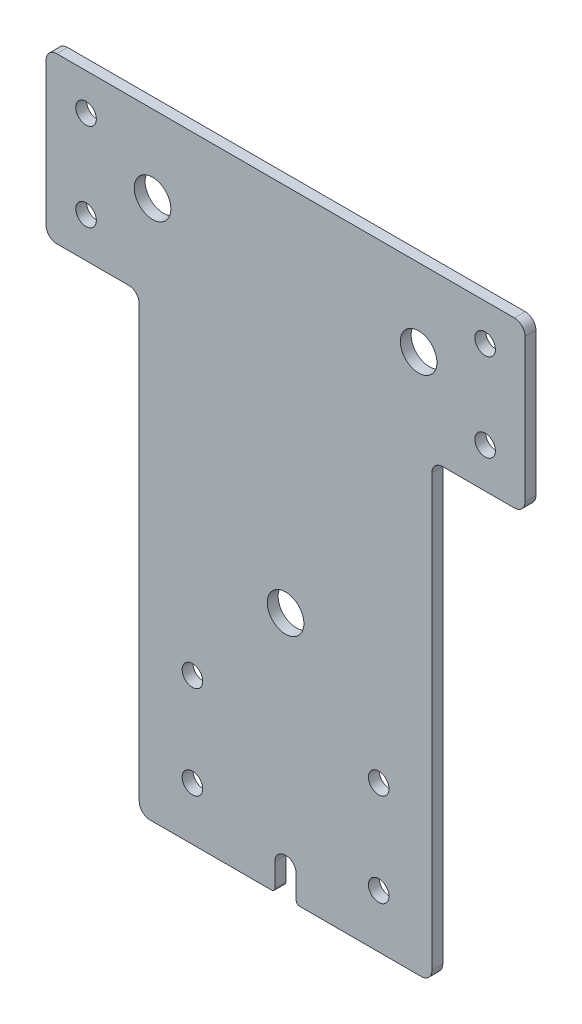
ISO-10303-21;
HEADER;
FILE_DESCRIPTION(('STEP AP214'),'2;1');
FILE_NAME('part.step','',(''),(''),'','','');
FILE_SCHEMA(('AUTOMOTIVE_DESIGN { 1 0 10303 214 1 1 1 1 }'));
ENDSEC;
DATA;
#1=APPLICATION_CONTEXT('core data for automotive mechanical design processes');
#2=APPLICATION_PROTOCOL_DEFINITION('international standard','automotive_design',2000,#1);
#3=PRODUCT_CONTEXT('',#1,'mechanical');
#4=PRODUCT('Part','Part','',(#3));
#5=PRODUCT_RELATED_PRODUCT_CATEGORY('part','',(#4));
#6=PRODUCT_DEFINITION_FORMATION('','',#4);
#7=PRODUCT_DEFINITION_CONTEXT('part definition',#1,'design');
#8=PRODUCT_DEFINITION('design','',#6,#7);
#9=PRODUCT_DEFINITION_SHAPE('','',#8);
#10=(LENGTH_UNIT() NAMED_UNIT(*) SI_UNIT(.MILLI.,.METRE.));
#11=(NAMED_UNIT(*) PLANE_ANGLE_UNIT() SI_UNIT($,.RADIAN.));
#12=(NAMED_UNIT(*) SI_UNIT($,.STERADIAN.) SOLID_ANGLE_UNIT());
#13=UNCERTAINTY_MEASURE_WITH_UNIT(LENGTH_MEASURE(1.E-05),#10,'distance_accuracy_value','');
#14=(GEOMETRIC_REPRESENTATION_CONTEXT(3) GLOBAL_UNCERTAINTY_ASSIGNED_CONTEXT((#13)) GLOBAL_UNIT_ASSIGNED_CONTEXT((#10,
#11,#12)) REPRESENTATION_CONTEXT('',''));
#15=CARTESIAN_POINT('',(0.,0.,0.));
#16=DIRECTION('',(0.,0.,1.));
#17=DIRECTION('',(1.,0.,0.));
#18=AXIS2_PLACEMENT_3D('',#15,#16,#17);
#19=CARTESIAN_POINT('',(69.85,-152.4,0.));
#20=DIRECTION('',(0.,-1.,0.));
#21=DIRECTION('',(0.,0.,-1.));
#22=AXIS2_PLACEMENT_3D('',#19,#20,#21);
#23=PLANE('',#22);
#24=DIRECTION('',(-1.,0.,0.));
#25=VECTOR('',#24,1.);
#26=CARTESIAN_POINT('',(69.85,-152.4,2.58825999999998));
#27=LINE('',#26,#25);
#28=CARTESIAN_POINT('',(67.31,-152.4,2.58825999999998));
#29=VERTEX_POINT('',#28);
#30=CARTESIAN_POINT('',(38.227,-152.4,2.58825999999998));
#31=VERTEX_POINT('',#30);
#32=EDGE_CURVE('E385',#29,#31,#27,.T.);
#33=ORIENTED_EDGE('',*,*,#32,.T.);
#34=DIRECTION('',(0.,0.,-1.));
#35=VECTOR('',#34,1.);
#36=CARTESIAN_POINT('',(38.227,-152.4,0.));
#37=LINE('',#36,#35);
#38=CARTESIAN_POINT('',(38.227,-152.4,0.));
#39=VERTEX_POINT('',#38);
#40=EDGE_CURVE('E51',#31,#39,#37,.T.);
#41=ORIENTED_EDGE('',*,*,#40,.T.);
#42=DIRECTION('',(-1.,0.,0.));
#43=VECTOR('',#42,1.);
#44=CARTESIAN_POINT('',(69.85,-152.4,0.));
#45=LINE('',#44,#43);
#46=CARTESIAN_POINT('',(67.31,-152.4,0.));
#47=VERTEX_POINT('',#46);
#48=EDGE_CURVE('E380',#47,#39,#45,.T.);
#49=ORIENTED_EDGE('',*,*,#48,.F.);
#50=DIRECTION('',(0.,0.,1.));
#51=VECTOR('',#50,1.);
#52=CARTESIAN_POINT('',(67.31,-152.4,2.58825999999998));
#53=LINE('',#52,#51);
#54=EDGE_CURVE('E461',#47,#29,#53,.T.);
#55=ORIENTED_EDGE('',*,*,#54,.T.);
#56=EDGE_LOOP('',(#33,#41,#49,#55));
#57=FACE_BOUND('',#56,.T.);
#58=ADVANCED_FACE('F42',(#57),#23,.T.);
#59=CARTESIAN_POINT('',(69.85,0.,0.));
#60=DIRECTION('',(0.,0.,1.));
#61=DIRECTION('',(0.,-1.,0.));
#62=AXIS2_PLACEMENT_3D('',#59,#60,#61);
#63=PLANE('',#62);
#64=CARTESIAN_POINT('',(66.675,-23.622,0.));
#65=DIRECTION('',(0.,0.,-1.));
#66=DIRECTION('',(0.,1.,0.));
#67=AXIS2_PLACEMENT_3D('',#64,#65,#66);
#68=CIRCLE('',#67,4.36879999999999);
#69=CARTESIAN_POINT('',(66.675,-19.2532,0.));
#70=VERTEX_POINT('',#69);
#71=EDGE_CURVE('E234',#70,#70,#68,.T.);
#72=ORIENTED_EDGE('',*,*,#71,.F.);
#73=EDGE_LOOP('',(#72));
#74=FACE_BOUND('',#73,.T.);
#75=CARTESIAN_POINT('',(3.175,-23.622,0.));
#76=DIRECTION('',(0.,0.,-1.));
#77=DIRECTION('',(0.,1.,0.));
#78=AXIS2_PLACEMENT_3D('',#75,#76,#77);
#79=CIRCLE('',#78,4.3688);
#80=CARTESIAN_POINT('',(3.175,-19.2532,0.));
#81=VERTEX_POINT('',#80);
#82=EDGE_CURVE('E243',#81,#81,#79,.T.);
#83=ORIENTED_EDGE('',*,*,#82,.F.);
#84=EDGE_LOOP('',(#83));
#85=FACE_BOUND('',#84,.T.);
#86=CARTESIAN_POINT('',(34.925,-93.472,0.));
#87=DIRECTION('',(0.,0.,-1.));
#88=DIRECTION('',(0.,1.,0.));
#89=AXIS2_PLACEMENT_3D('',#86,#87,#88);
#90=CIRCLE('',#89,4.3688);
#91=CARTESIAN_POINT('',(34.925,-89.1032,0.));
#92=VERTEX_POINT('',#91);
#93=EDGE_CURVE('E251',#92,#92,#90,.T.);
#94=ORIENTED_EDGE('',*,*,#93,.F.);
#95=EDGE_LOOP('',(#94));
#96=FACE_BOUND('',#95,.T.);
#97=CARTESIAN_POINT('',(12.7,-117.475,0.));
#98=DIRECTION('',(0.,0.,-1.));
#99=DIRECTION('',(0.,1.,0.));
#100=AXIS2_PLACEMENT_3D('',#97,#98,#99);
#101=CIRCLE('',#100,2.45744999999999);
#102=CARTESIAN_POINT('',(12.7,-115.01755,0.));
#103=VERTEX_POINT('',#102);
#104=EDGE_CURVE('E323',#103,#103,#101,.T.);
#105=ORIENTED_EDGE('',*,*,#104,.F.);
#106=EDGE_LOOP('',(#105));
#107=FACE_BOUND('',#106,.T.);
#108=CARTESIAN_POINT('',(12.7,-139.7,0.));
#109=DIRECTION('',(0.,0.,-1.));
#110=DIRECTION('',(0.,1.,0.));
#111=AXIS2_PLACEMENT_3D('',#108,#109,#110);
#112=CIRCLE('',#111,2.45744999999999);
#113=CARTESIAN_POINT('',(12.7,-137.24255,0.));
#114=VERTEX_POINT('',#113);
#115=EDGE_CURVE('E315',#114,#114,#112,.T.);
#116=ORIENTED_EDGE('',*,*,#115,.F.);
#117=EDGE_LOOP('',(#116));
#118=FACE_BOUND('',#117,.T.);
#119=CARTESIAN_POINT('',(57.15,-139.7,0.));
#120=DIRECTION('',(0.,0.,-1.));
#121=DIRECTION('',(0.,1.,0.));
#122=AXIS2_PLACEMENT_3D('',#119,#120,#121);
#123=CIRCLE('',#122,2.45744999999999);
#124=CARTESIAN_POINT('',(57.15,-137.24255,0.));
#125=VERTEX_POINT('',#124);
#126=EDGE_CURVE('E307',#125,#125,#123,.T.);
#127=ORIENTED_EDGE('',*,*,#126,.F.);
#128=EDGE_LOOP('',(#127));
#129=FACE_BOUND('',#128,.T.);
#130=CARTESIAN_POINT('',(57.15,-117.475,0.));
#131=DIRECTION('',(0.,0.,-1.));
#132=DIRECTION('',(0.,1.,0.));
#133=AXIS2_PLACEMENT_3D('',#130,#131,#132);
#134=CIRCLE('',#133,2.45744999999999);
#135=CARTESIAN_POINT('',(57.15,-115.01755,0.));
#136=VERTEX_POINT('',#135);
#137=EDGE_CURVE('E299',#136,#136,#134,.T.);
#138=ORIENTED_EDGE('',*,*,#137,.F.);
#139=EDGE_LOOP('',(#138));
#140=FACE_BOUND('',#139,.T.);
#141=CARTESIAN_POINT('',(-12.7,-13.97,0.));
#142=DIRECTION('',(0.,0.,-1.));
#143=DIRECTION('',(0.,1.,0.));
#144=AXIS2_PLACEMENT_3D('',#141,#142,#143);
#145=CIRCLE('',#144,2.45744999999999);
#146=CARTESIAN_POINT('',(-12.7,-11.51255,0.));
#147=VERTEX_POINT('',#146);
#148=EDGE_CURVE('E291',#147,#147,#145,.T.);
#149=ORIENTED_EDGE('',*,*,#148,.F.);
#150=EDGE_LOOP('',(#149));
#151=FACE_BOUND('',#150,.T.);
#152=CARTESIAN_POINT('',(-12.7,-34.925,0.));
#153=DIRECTION('',(0.,0.,-1.));
#154=DIRECTION('',(0.,1.,0.));
#155=AXIS2_PLACEMENT_3D('',#152,#153,#154);
#156=CIRCLE('',#155,2.45744999999999);
#157=CARTESIAN_POINT('',(-12.7,-32.46755,0.));
#158=VERTEX_POINT('',#157);
#159=EDGE_CURVE('E283',#158,#158,#156,.T.);
#160=ORIENTED_EDGE('',*,*,#159,.F.);
#161=EDGE_LOOP('',(#160));
#162=FACE_BOUND('',#161,.T.);
#163=CARTESIAN_POINT('',(82.55,-34.925,0.));
#164=DIRECTION('',(0.,0.,-1.));
#165=DIRECTION('',(0.,1.,0.));
#166=AXIS2_PLACEMENT_3D('',#163,#164,#165);
#167=CIRCLE('',#166,2.45744999999999);
#168=CARTESIAN_POINT('',(82.55,-32.46755,0.));
#169=VERTEX_POINT('',#168);
#170=EDGE_CURVE('E275',#169,#169,#167,.T.);
#171=ORIENTED_EDGE('',*,*,#170,.F.);
#172=EDGE_LOOP('',(#171));
#173=FACE_BOUND('',#172,.T.);
#174=CARTESIAN_POINT('',(82.55,-13.97,0.));
#175=DIRECTION('',(0.,0.,-1.));
#176=DIRECTION('',(0.,1.,0.));
#177=AXIS2_PLACEMENT_3D('',#174,#175,#176);
#178=CIRCLE('',#177,2.45744999999999);
#179=CARTESIAN_POINT('',(82.55,-11.51255,0.));
#180=VERTEX_POINT('',#179);
#181=EDGE_CURVE('E264',#180,#180,#178,.T.);
#182=ORIENTED_EDGE('',*,*,#181,.F.);
#183=EDGE_LOOP('',(#182));
#184=FACE_BOUND('',#183,.T.);
#185=DIRECTION('',(0.,1.,0.));
#186=VECTOR('',#185,1.);
#187=CARTESIAN_POINT('',(32.385,-146.05,0.));
#188=LINE('',#187,#186);
#189=CARTESIAN_POINT('',(32.385,-151.638,0.));
#190=VERTEX_POINT('',#189);
#191=CARTESIAN_POINT('',(32.385,-146.05,0.));
#192=VERTEX_POINT('',#191);
#193=EDGE_CURVE('E211',#190,#192,#188,.T.);
#194=ORIENTED_EDGE('',*,*,#193,.F.);
#195=CARTESIAN_POINT('',(31.623,-151.638,0.));
#196=DIRECTION('',(0.,0.,1.));
#197=DIRECTION('',(0.,-1.,0.));
#198=AXIS2_PLACEMENT_3D('',#195,#196,#197);
#199=CIRCLE('',#198,0.762);
#200=CARTESIAN_POINT('',(31.623,-152.4,0.));
#201=VERTEX_POINT('',#200);
#202=EDGE_CURVE('E500',#190,#201,#199,.F.);
#203=ORIENTED_EDGE('',*,*,#202,.T.);
#204=CARTESIAN_POINT('',(2.54,-152.4,0.));
#205=VERTEX_POINT('',#204);
#206=EDGE_CURVE('E373',#201,#205,#45,.T.);
#207=ORIENTED_EDGE('',*,*,#206,.T.);
#208=CARTESIAN_POINT('',(2.54,-149.86,0.));
#209=DIRECTION('',(0.,0.,1.));
#210=DIRECTION('',(0.,-1.,0.));
#211=AXIS2_PLACEMENT_3D('',#208,#209,#210);
#212=CIRCLE('',#211,2.54);
#213=CARTESIAN_POINT('',(0.,-149.86,0.));
#214=VERTEX_POINT('',#213);
#215=EDGE_CURVE('E426',#205,#214,#212,.F.);
#216=ORIENTED_EDGE('',*,*,#215,.T.);
#217=DIRECTION('',(0.,1.,0.));
#218=VECTOR('',#217,1.);
#219=CARTESIAN_POINT('',(0.,0.,0.));
#220=LINE('',#219,#218);
#221=CARTESIAN_POINT('',(0.,-46.99,0.));
#222=VERTEX_POINT('',#221);
#223=EDGE_CURVE('E360',#214,#222,#220,.T.);
#224=ORIENTED_EDGE('',*,*,#223,.T.);
#225=CARTESIAN_POINT('',(-2.54,-46.99,0.));
#226=DIRECTION('',(0.,0.,1.));
#227=DIRECTION('',(0.,-1.,0.));
#228=AXIS2_PLACEMENT_3D('',#225,#226,#227);
#229=CIRCLE('',#228,2.54);
#230=CARTESIAN_POINT('',(-2.54,-44.45,0.));
#231=VERTEX_POINT('',#230);
#232=EDGE_CURVE('E482',#222,#231,#229,.T.);
#233=ORIENTED_EDGE('',*,*,#232,.T.);
#234=DIRECTION('',(-1.,0.,0.));
#235=VECTOR('',#234,1.);
#236=CARTESIAN_POINT('',(0.,-44.45,0.));
#237=LINE('',#236,#235);
#238=CARTESIAN_POINT('',(-19.685,-44.45,0.));
#239=VERTEX_POINT('',#238);
#240=EDGE_CURVE('E331',#231,#239,#237,.T.);
#241=ORIENTED_EDGE('',*,*,#240,.T.);
#242=CARTESIAN_POINT('',(-19.685,-41.91,0.));
#243=DIRECTION('',(0.,0.,1.));
#244=DIRECTION('',(0.,-1.,0.));
#245=AXIS2_PLACEMENT_3D('',#242,#243,#244);
#246=CIRCLE('',#245,2.54);
#247=CARTESIAN_POINT('',(-22.225,-41.91,0.));
#248=VERTEX_POINT('',#247);
#249=EDGE_CURVE('E429',#239,#248,#246,.F.);
#250=ORIENTED_EDGE('',*,*,#249,.T.);
#251=DIRECTION('',(0.,1.,0.));
#252=VECTOR('',#251,1.);
#253=CARTESIAN_POINT('',(-22.225,0.,0.));
#254=LINE('',#253,#252);
#255=CARTESIAN_POINT('',(-22.225,-7.70255,0.));
#256=VERTEX_POINT('',#255);
#257=EDGE_CURVE('E332',#248,#256,#254,.T.);
#258=ORIENTED_EDGE('',*,*,#257,.T.);
#259=CARTESIAN_POINT('',(-19.685,-7.70255,0.));
#260=DIRECTION('',(0.,0.,1.));
#261=DIRECTION('',(0.,-1.,0.));
#262=AXIS2_PLACEMENT_3D('',#259,#260,#261);
#263=CIRCLE('',#262,2.54);
#264=CARTESIAN_POINT('',(-19.685,-5.16255,0.));
#265=VERTEX_POINT('',#264);
#266=EDGE_CURVE('E435',#256,#265,#263,.F.);
#267=ORIENTED_EDGE('',*,*,#266,.T.);
#268=DIRECTION('',(-1.,0.,0.));
#269=VECTOR('',#268,1.);
#270=CARTESIAN_POINT('',(92.075,-5.16255,0.));
#271=LINE('',#270,#269);
#272=CARTESIAN_POINT('',(89.535,-5.16255,0.));
#273=VERTEX_POINT('',#272);
#274=EDGE_CURVE('E259',#273,#265,#271,.T.);
#275=ORIENTED_EDGE('',*,*,#274,.F.);
#276=CARTESIAN_POINT('',(89.535,-7.70255,0.));
#277=DIRECTION('',(0.,0.,1.));
#278=DIRECTION('',(0.,-1.,0.));
#279=AXIS2_PLACEMENT_3D('',#276,#277,#278);
#280=CIRCLE('',#279,2.54);
#281=CARTESIAN_POINT('',(92.075,-7.70255,0.));
#282=VERTEX_POINT('',#281);
#283=EDGE_CURVE('E432',#273,#282,#280,.F.);
#284=ORIENTED_EDGE('',*,*,#283,.T.);
#285=DIRECTION('',(0.,-1.,0.));
#286=VECTOR('',#285,1.);
#287=CARTESIAN_POINT('',(92.075,0.,0.));
#288=LINE('',#287,#286);
#289=CARTESIAN_POINT('',(92.075,-41.91,0.));
#290=VERTEX_POINT('',#289);
#291=EDGE_CURVE('E344',#282,#290,#288,.T.);
#292=ORIENTED_EDGE('',*,*,#291,.T.);
#293=CARTESIAN_POINT('',(89.535,-41.91,0.));
#294=DIRECTION('',(0.,0.,1.));
#295=DIRECTION('',(0.,-1.,0.));
#296=AXIS2_PLACEMENT_3D('',#293,#294,#295);
#297=CIRCLE('',#296,2.54);
#298=CARTESIAN_POINT('',(89.535,-44.45,0.));
#299=VERTEX_POINT('',#298);
#300=EDGE_CURVE('E420',#290,#299,#297,.F.);
#301=ORIENTED_EDGE('',*,*,#300,.T.);
#302=DIRECTION('',(-1.,0.,0.));
#303=VECTOR('',#302,1.);
#304=CARTESIAN_POINT('',(69.85,-44.45,0.));
#305=LINE('',#304,#303);
#306=CARTESIAN_POINT('',(72.39,-44.45,0.));
#307=VERTEX_POINT('',#306);
#308=EDGE_CURVE('E348',#299,#307,#305,.T.);
#309=ORIENTED_EDGE('',*,*,#308,.T.);
#310=CARTESIAN_POINT('',(72.39,-46.99,0.));
#311=DIRECTION('',(0.,0.,1.));
#312=DIRECTION('',(0.,-1.,0.));
#313=AXIS2_PLACEMENT_3D('',#310,#311,#312);
#314=CIRCLE('',#313,2.54);
#315=CARTESIAN_POINT('',(69.85,-46.99,0.));
#316=VERTEX_POINT('',#315);
#317=EDGE_CURVE('E488',#307,#316,#314,.T.);
#318=ORIENTED_EDGE('',*,*,#317,.T.);
#319=DIRECTION('',(0.,1.,0.));
#320=VECTOR('',#319,1.);
#321=CARTESIAN_POINT('',(69.85,0.,0.));
#322=LINE('',#321,#320);
#323=CARTESIAN_POINT('',(69.85,-149.86,0.));
#324=VERTEX_POINT('',#323);
#325=EDGE_CURVE('E364',#324,#316,#322,.T.);
#326=ORIENTED_EDGE('',*,*,#325,.F.);
#327=CARTESIAN_POINT('',(67.31,-149.86,0.));
#328=DIRECTION('',(0.,0.,1.));
#329=DIRECTION('',(0.,-1.,0.));
#330=AXIS2_PLACEMENT_3D('',#327,#328,#329);
#331=CIRCLE('',#330,2.54);
#332=EDGE_CURVE('E423',#324,#47,#331,.F.);
#333=ORIENTED_EDGE('',*,*,#332,.T.);
#334=ORIENTED_EDGE('',*,*,#48,.T.);
#335=CARTESIAN_POINT('',(38.227,-151.638,0.));
#336=DIRECTION('',(0.,0.,1.));
#337=DIRECTION('',(0.,-1.,0.));
#338=AXIS2_PLACEMENT_3D('',#335,#336,#337);
#339=CIRCLE('',#338,0.762);
#340=CARTESIAN_POINT('',(37.465,-151.638,0.));
#341=VERTEX_POINT('',#340);
#342=EDGE_CURVE('E497',#39,#341,#339,.F.);
#343=ORIENTED_EDGE('',*,*,#342,.T.);
#344=DIRECTION('',(0.,-1.,0.));
#345=VECTOR('',#344,1.);
#346=CARTESIAN_POINT('',(37.465,-152.4,0.));
#347=LINE('',#346,#345);
#348=CARTESIAN_POINT('',(37.465,-146.05,0.));
#349=VERTEX_POINT('',#348);
#350=EDGE_CURVE('E205',#349,#341,#347,.T.);
#351=ORIENTED_EDGE('',*,*,#350,.F.);
#352=CARTESIAN_POINT('',(34.925,-146.05,0.));
#353=DIRECTION('',(0.,0.,-1.));
#354=DIRECTION('',(0.,-1.,0.));
#355=AXIS2_PLACEMENT_3D('',#352,#353,#354);
#356=CIRCLE('',#355,2.54);
#357=EDGE_CURVE('E228',#192,#349,#356,.T.);
#358=ORIENTED_EDGE('',*,*,#357,.F.);
#359=EDGE_LOOP('',(#194,#203,#207,#216,#224,#233,#241,#250,#258,#267,#275,#284,#292,#301,#309,
#318,#326,#333,#334,#343,#351,#358));
#360=FACE_BOUND('',#359,.T.);
#361=ADVANCED_FACE('F518',(#74,#85,#96,#107,#118,#129,#140,#151,#162,#173,#184,#360),#63,.F.);
#362=CARTESIAN_POINT('',(69.85,0.,2.58826));
#363=DIRECTION('',(0.,0.,1.));
#364=DIRECTION('',(0.,-1.,0.));
#365=AXIS2_PLACEMENT_3D('',#362,#363,#364);
#366=PLANE('',#365);
#367=CARTESIAN_POINT('',(31.623,-152.4,2.58825999999998));
#368=VERTEX_POINT('',#367);
#369=CARTESIAN_POINT('',(2.54,-152.4,2.58825999999998));
#370=VERTEX_POINT('',#369);
#371=EDGE_CURVE('E384',#368,#370,#27,.T.);
#372=ORIENTED_EDGE('',*,*,#371,.F.);
#373=CARTESIAN_POINT('',(31.623,-151.638,2.58825999999998));
#374=DIRECTION('',(0.,0.,1.));
#375=DIRECTION('',(0.,-1.,0.));
#376=AXIS2_PLACEMENT_3D('',#373,#374,#375);
#377=CIRCLE('',#376,0.762);
#378=CARTESIAN_POINT('',(32.385,-151.638,2.58826000000003));
#379=VERTEX_POINT('',#378);
#380=EDGE_CURVE('E200',#368,#379,#377,.T.);
#381=ORIENTED_EDGE('',*,*,#380,.T.);
#382=DIRECTION('',(0.,1.,0.));
#383=VECTOR('',#382,1.);
#384=CARTESIAN_POINT('',(32.385,-146.05,2.58826000000003));
#385=LINE('',#384,#383);
#386=CARTESIAN_POINT('',(32.385,-146.05,2.58826000000003));
#387=VERTEX_POINT('',#386);
#388=EDGE_CURVE('E192',#379,#387,#385,.T.);
#389=ORIENTED_EDGE('',*,*,#388,.T.);
#390=CARTESIAN_POINT('',(34.925,-146.05,2.58826000000003));
#391=DIRECTION('',(0.,0.,-1.));
#392=DIRECTION('',(0.,-1.,0.));
#393=AXIS2_PLACEMENT_3D('',#390,#391,#392);
#394=CIRCLE('',#393,2.54);
#395=CARTESIAN_POINT('',(37.465,-146.05,2.58826000000003));
#396=VERTEX_POINT('',#395);
#397=EDGE_CURVE('E198',#387,#396,#394,.T.);
#398=ORIENTED_EDGE('',*,*,#397,.T.);
#399=DIRECTION('',(0.,-1.,0.));
#400=VECTOR('',#399,1.);
#401=CARTESIAN_POINT('',(37.465,-152.4,2.58826000000003));
#402=LINE('',#401,#400);
#403=CARTESIAN_POINT('',(37.465,-151.638,2.58826000000003));
#404=VERTEX_POINT('',#403);
#405=EDGE_CURVE('E217',#396,#404,#402,.T.);
#406=ORIENTED_EDGE('',*,*,#405,.T.);
#407=CARTESIAN_POINT('',(38.227,-151.638,2.58825999999998));
#408=DIRECTION('',(0.,0.,1.));
#409=DIRECTION('',(0.,-1.,0.));
#410=AXIS2_PLACEMENT_3D('',#407,#408,#409);
#411=CIRCLE('',#410,0.762);
#412=EDGE_CURVE('E58',#404,#31,#411,.T.);
#413=ORIENTED_EDGE('',*,*,#412,.T.);
#414=ORIENTED_EDGE('',*,*,#32,.F.);
#415=CARTESIAN_POINT('',(67.31,-149.86,2.58825999999998));
#416=DIRECTION('',(0.,0.,1.));
#417=DIRECTION('',(0.,-1.,0.));
#418=AXIS2_PLACEMENT_3D('',#415,#416,#417);
#419=CIRCLE('',#418,2.54);
#420=CARTESIAN_POINT('',(69.85,-149.86,2.58825999999998));
#421=VERTEX_POINT('',#420);
#422=EDGE_CURVE('E398',#29,#421,#419,.T.);
#423=ORIENTED_EDGE('',*,*,#422,.T.);
#424=DIRECTION('',(0.,1.,0.));
#425=VECTOR('',#424,1.);
#426=CARTESIAN_POINT('',(69.85,0.,2.58826));
#427=LINE('',#426,#425);
#428=CARTESIAN_POINT('',(69.85,-46.99,2.58825999999999));
#429=VERTEX_POINT('',#428);
#430=EDGE_CURVE('E368',#421,#429,#427,.T.);
#431=ORIENTED_EDGE('',*,*,#430,.T.);
#432=CARTESIAN_POINT('',(72.39,-46.99,2.58826));
#433=DIRECTION('',(0.,0.,1.));
#434=DIRECTION('',(0.,-1.,0.));
#435=AXIS2_PLACEMENT_3D('',#432,#433,#434);
#436=CIRCLE('',#435,2.54);
#437=CARTESIAN_POINT('',(72.39,-44.45,2.58826));
#438=VERTEX_POINT('',#437);
#439=EDGE_CURVE('E491',#429,#438,#436,.F.);
#440=ORIENTED_EDGE('',*,*,#439,.T.);
#441=DIRECTION('',(-1.,0.,0.));
#442=VECTOR('',#441,1.);
#443=CARTESIAN_POINT('',(69.85,-44.45,2.58826));
#444=LINE('',#443,#442);
#445=CARTESIAN_POINT('',(89.535,-44.45,2.58826));
#446=VERTEX_POINT('',#445);
#447=EDGE_CURVE('E356',#446,#438,#444,.T.);
#448=ORIENTED_EDGE('',*,*,#447,.F.);
#449=CARTESIAN_POINT('',(89.535,-41.91,2.58826));
#450=DIRECTION('',(0.,0.,1.));
#451=DIRECTION('',(0.,-1.,0.));
#452=AXIS2_PLACEMENT_3D('',#449,#450,#451);
#453=CIRCLE('',#452,2.54);
#454=CARTESIAN_POINT('',(92.075,-41.91,2.58826));
#455=VERTEX_POINT('',#454);
#456=EDGE_CURVE('E395',#446,#455,#453,.T.);
#457=ORIENTED_EDGE('',*,*,#456,.T.);
#458=DIRECTION('',(0.,-1.,0.));
#459=VECTOR('',#458,1.);
#460=CARTESIAN_POINT('',(92.075,0.,2.58826));
#461=LINE('',#460,#459);
#462=CARTESIAN_POINT('',(92.075,-7.70255,2.58826));
#463=VERTEX_POINT('',#462);
#464=EDGE_CURVE('E352',#463,#455,#461,.T.);
#465=ORIENTED_EDGE('',*,*,#464,.F.);
#466=CARTESIAN_POINT('',(89.535,-7.70255,2.58826));
#467=DIRECTION('',(0.,0.,1.));
#468=DIRECTION('',(0.,-1.,0.));
#469=AXIS2_PLACEMENT_3D('',#466,#467,#468);
#470=CIRCLE('',#469,2.54);
#471=CARTESIAN_POINT('',(89.535,-5.16255,2.58826));
#472=VERTEX_POINT('',#471);
#473=EDGE_CURVE('E408',#463,#472,#470,.T.);
#474=ORIENTED_EDGE('',*,*,#473,.T.);
#475=DIRECTION('',(1.,0.,0.));
#476=VECTOR('',#475,1.);
#477=CARTESIAN_POINT('',(69.85,-5.16255,2.58826));
#478=LINE('',#477,#476);
#479=CARTESIAN_POINT('',(-19.685,-5.16255,2.58826));
#480=VERTEX_POINT('',#479);
#481=EDGE_CURVE('E260',#472,#480,#478,.F.);
#482=ORIENTED_EDGE('',*,*,#481,.T.);
#483=CARTESIAN_POINT('',(-19.685,-7.70255,2.58826));
#484=DIRECTION('',(0.,0.,1.));
#485=DIRECTION('',(0.,-1.,0.));
#486=AXIS2_PLACEMENT_3D('',#483,#484,#485);
#487=CIRCLE('',#486,2.54);
#488=CARTESIAN_POINT('',(-22.225,-7.70255,2.58826));
#489=VERTEX_POINT('',#488);
#490=EDGE_CURVE('E411',#480,#489,#487,.T.);
#491=ORIENTED_EDGE('',*,*,#490,.T.);
#492=DIRECTION('',(0.,1.,0.));
#493=VECTOR('',#492,1.);
#494=CARTESIAN_POINT('',(-22.225,0.,2.58826));
#495=LINE('',#494,#493);
#496=CARTESIAN_POINT('',(-22.225,-41.91,2.58826));
#497=VERTEX_POINT('',#496);
#498=EDGE_CURVE('E340',#497,#489,#495,.T.);
#499=ORIENTED_EDGE('',*,*,#498,.F.);
#500=CARTESIAN_POINT('',(-19.685,-41.91,2.58826));
#501=DIRECTION('',(0.,0.,1.));
#502=DIRECTION('',(0.,-1.,0.));
#503=AXIS2_PLACEMENT_3D('',#500,#501,#502);
#504=CIRCLE('',#503,2.54);
#505=CARTESIAN_POINT('',(-19.685,-44.45,2.58826));
#506=VERTEX_POINT('',#505);
#507=EDGE_CURVE('E405',#497,#506,#504,.T.);
#508=ORIENTED_EDGE('',*,*,#507,.T.);
#509=DIRECTION('',(-1.,0.,0.));
#510=VECTOR('',#509,1.);
#511=CARTESIAN_POINT('',(0.,-44.45,2.58826));
#512=LINE('',#511,#510);
#513=CARTESIAN_POINT('',(-2.54,-44.45,2.58826));
#514=VERTEX_POINT('',#513);
#515=EDGE_CURVE('E336',#514,#506,#512,.T.);
#516=ORIENTED_EDGE('',*,*,#515,.F.);
#517=CARTESIAN_POINT('',(-2.54,-46.99,2.58825999999999));
#518=DIRECTION('',(0.,0.,1.));
#519=DIRECTION('',(0.,-1.,0.));
#520=AXIS2_PLACEMENT_3D('',#517,#518,#519);
#521=CIRCLE('',#520,2.54);
#522=CARTESIAN_POINT('',(0.,-46.99,2.58825999999999));
#523=VERTEX_POINT('',#522);
#524=EDGE_CURVE('E485',#514,#523,#521,.F.);
#525=ORIENTED_EDGE('',*,*,#524,.T.);
#526=DIRECTION('',(0.,1.,0.));
#527=VECTOR('',#526,1.);
#528=CARTESIAN_POINT('',(0.,0.,2.58826));
#529=LINE('',#528,#527);
#530=CARTESIAN_POINT('',(0.,-149.86,2.58825999999998));
#531=VERTEX_POINT('',#530);
#532=EDGE_CURVE('E369',#531,#523,#529,.T.);
#533=ORIENTED_EDGE('',*,*,#532,.F.);
#534=CARTESIAN_POINT('',(2.54,-149.86,2.58825999999998));
#535=DIRECTION('',(0.,0.,1.));
#536=DIRECTION('',(0.,-1.,0.));
#537=AXIS2_PLACEMENT_3D('',#534,#535,#536);
#538=CIRCLE('',#537,2.54);
#539=EDGE_CURVE('E401',#531,#370,#538,.T.);
#540=ORIENTED_EDGE('',*,*,#539,.T.);
#541=EDGE_LOOP('',(#372,#381,#389,#398,#406,#413,#414,#423,#431,#440,#448,#457,#465,#474,#482,
#491,#499,#508,#516,#525,#533,#540));
#542=FACE_BOUND('',#541,.T.);
#543=CARTESIAN_POINT('',(66.675,-23.622,2.58826000000003));
#544=DIRECTION('',(0.,0.,-1.));
#545=DIRECTION('',(0.,1.,0.));
#546=AXIS2_PLACEMENT_3D('',#543,#544,#545);
#547=CIRCLE('',#546,4.36879999999999);
#548=CARTESIAN_POINT('',(66.675,-19.2532,2.58826000000003));
#549=VERTEX_POINT('',#548);
#550=EDGE_CURVE('E239',#549,#549,#547,.T.);
#551=ORIENTED_EDGE('',*,*,#550,.T.);
#552=EDGE_LOOP('',(#551));
#553=FACE_BOUND('',#552,.T.);
#554=CARTESIAN_POINT('',(3.175,-23.622,2.58826000000003));
#555=DIRECTION('',(0.,0.,-1.));
#556=DIRECTION('',(0.,1.,0.));
#557=AXIS2_PLACEMENT_3D('',#554,#555,#556);
#558=CIRCLE('',#557,4.3688);
#559=CARTESIAN_POINT('',(3.175,-19.2532,2.58826000000003));
#560=VERTEX_POINT('',#559);
#561=EDGE_CURVE('E247',#560,#560,#558,.T.);
#562=ORIENTED_EDGE('',*,*,#561,.T.);
#563=EDGE_LOOP('',(#562));
#564=FACE_BOUND('',#563,.T.);
#565=CARTESIAN_POINT('',(34.925,-93.472,2.58826000000002));
#566=DIRECTION('',(0.,0.,-1.));
#567=DIRECTION('',(0.,1.,0.));
#568=AXIS2_PLACEMENT_3D('',#565,#566,#567);
#569=CIRCLE('',#568,4.3688);
#570=CARTESIAN_POINT('',(34.925,-89.1032,2.58826000000003));
#571=VERTEX_POINT('',#570);
#572=EDGE_CURVE('E255',#571,#571,#569,.T.);
#573=ORIENTED_EDGE('',*,*,#572,.T.);
#574=EDGE_LOOP('',(#573));
#575=FACE_BOUND('',#574,.T.);
#576=CARTESIAN_POINT('',(82.55,-13.97,2.58826000000002));
#577=DIRECTION('',(0.,0.,-1.));
#578=DIRECTION('',(0.,1.,0.));
#579=AXIS2_PLACEMENT_3D('',#576,#577,#578);
#580=CIRCLE('',#579,2.45745);
#581=CARTESIAN_POINT('',(82.55,-11.51255,2.58826000000002));
#582=VERTEX_POINT('',#581);
#583=EDGE_CURVE('E271',#582,#582,#580,.T.);
#584=ORIENTED_EDGE('',*,*,#583,.T.);
#585=EDGE_LOOP('',(#584));
#586=FACE_BOUND('',#585,.T.);
#587=CARTESIAN_POINT('',(82.55,-34.925,2.58826000000002));
#588=DIRECTION('',(0.,0.,-1.));
#589=DIRECTION('',(0.,1.,0.));
#590=AXIS2_PLACEMENT_3D('',#587,#588,#589);
#591=CIRCLE('',#590,2.45745);
#592=CARTESIAN_POINT('',(82.55,-32.46755,2.58826000000002));
#593=VERTEX_POINT('',#592);
#594=EDGE_CURVE('E279',#593,#593,#591,.T.);
#595=ORIENTED_EDGE('',*,*,#594,.T.);
#596=EDGE_LOOP('',(#595));
#597=FACE_BOUND('',#596,.T.);
#598=CARTESIAN_POINT('',(-12.7,-34.925,2.58826000000002));
#599=DIRECTION('',(0.,0.,-1.));
#600=DIRECTION('',(0.,1.,0.));
#601=AXIS2_PLACEMENT_3D('',#598,#599,#600);
#602=CIRCLE('',#601,2.45745);
#603=CARTESIAN_POINT('',(-12.7,-32.46755,2.58826000000002));
#604=VERTEX_POINT('',#603);
#605=EDGE_CURVE('E287',#604,#604,#602,.T.);
#606=ORIENTED_EDGE('',*,*,#605,.T.);
#607=EDGE_LOOP('',(#606));
#608=FACE_BOUND('',#607,.T.);
#609=CARTESIAN_POINT('',(-12.7,-13.97,2.58826000000002));
#610=DIRECTION('',(0.,0.,-1.));
#611=DIRECTION('',(0.,1.,0.));
#612=AXIS2_PLACEMENT_3D('',#609,#610,#611);
#613=CIRCLE('',#612,2.45745);
#614=CARTESIAN_POINT('',(-12.7,-11.51255,2.58826000000002));
#615=VERTEX_POINT('',#614);
#616=EDGE_CURVE('E295',#615,#615,#613,.T.);
#617=ORIENTED_EDGE('',*,*,#616,.T.);
#618=EDGE_LOOP('',(#617));
#619=FACE_BOUND('',#618,.T.);
#620=CARTESIAN_POINT('',(57.15,-117.475,2.58826));
#621=DIRECTION('',(0.,0.,-1.));
#622=DIRECTION('',(0.,1.,0.));
#623=AXIS2_PLACEMENT_3D('',#620,#621,#622);
#624=CIRCLE('',#623,2.45744999999999);
#625=CARTESIAN_POINT('',(57.15,-115.01755,2.58826000000001));
#626=VERTEX_POINT('',#625);
#627=EDGE_CURVE('E303',#626,#626,#624,.T.);
#628=ORIENTED_EDGE('',*,*,#627,.T.);
#629=EDGE_LOOP('',(#628));
#630=FACE_BOUND('',#629,.T.);
#631=CARTESIAN_POINT('',(57.15,-139.7,2.58826));
#632=DIRECTION('',(0.,0.,-1.));
#633=DIRECTION('',(0.,1.,0.));
#634=AXIS2_PLACEMENT_3D('',#631,#632,#633);
#635=CIRCLE('',#634,2.45744999999999);
#636=CARTESIAN_POINT('',(57.15,-137.24255,2.58826));
#637=VERTEX_POINT('',#636);
#638=EDGE_CURVE('E311',#637,#637,#635,.T.);
#639=ORIENTED_EDGE('',*,*,#638,.T.);
#640=EDGE_LOOP('',(#639));
#641=FACE_BOUND('',#640,.T.);
#642=CARTESIAN_POINT('',(12.7,-139.7,2.58826));
#643=DIRECTION('',(0.,0.,-1.));
#644=DIRECTION('',(0.,1.,0.));
#645=AXIS2_PLACEMENT_3D('',#642,#643,#644);
#646=CIRCLE('',#645,2.45745);
#647=CARTESIAN_POINT('',(12.7,-137.24255,2.58826));
#648=VERTEX_POINT('',#647);
#649=EDGE_CURVE('E319',#648,#648,#646,.T.);
#650=ORIENTED_EDGE('',*,*,#649,.T.);
#651=EDGE_LOOP('',(#650));
#652=FACE_BOUND('',#651,.T.);
#653=CARTESIAN_POINT('',(12.7,-117.475,2.58826));
#654=DIRECTION('',(0.,0.,-1.));
#655=DIRECTION('',(0.,1.,0.));
#656=AXIS2_PLACEMENT_3D('',#653,#654,#655);
#657=CIRCLE('',#656,2.45745);
#658=CARTESIAN_POINT('',(12.7,-115.01755,2.58826000000001));
#659=VERTEX_POINT('',#658);
#660=EDGE_CURVE('E327',#659,#659,#657,.T.);
#661=ORIENTED_EDGE('',*,*,#660,.T.);
#662=EDGE_LOOP('',(#661));
#663=FACE_BOUND('',#662,.T.);
#664=ADVANCED_FACE('F195',(#542,#553,#564,#575,#586,#597,#608,#619,#630,#641,#652,#663),#366,.T.);
#665=CARTESIAN_POINT('',(92.075,0.,52.2848707999328));
#666=DIRECTION('',(1.,0.,0.));
#667=DIRECTION('',(0.,0.,-1.));
#668=AXIS2_PLACEMENT_3D('',#665,#666,#667);
#669=PLANE('',#668);
#670=ORIENTED_EDGE('',*,*,#291,.F.);
#671=DIRECTION('',(0.,0.,1.));
#672=VECTOR('',#671,1.);
#673=CARTESIAN_POINT('',(92.075,-7.70255000000001,52.2848707999328));
#674=LINE('',#673,#672);
#675=EDGE_CURVE('E442',#282,#463,#674,.T.);
#676=ORIENTED_EDGE('',*,*,#675,.T.);
#677=ORIENTED_EDGE('',*,*,#464,.T.);
#678=DIRECTION('',(0.,0.,-1.));
#679=VECTOR('',#678,1.);
#680=CARTESIAN_POINT('',(92.075,-41.91,52.2848707999328));
#681=LINE('',#680,#679);
#682=EDGE_CURVE('E438',#455,#290,#681,.T.);
#683=ORIENTED_EDGE('',*,*,#682,.T.);
#684=EDGE_LOOP('',(#670,#676,#677,#683));
#685=FACE_BOUND('',#684,.T.);
#686=ADVANCED_FACE('F545',(#685),#669,.T.);
#687=CARTESIAN_POINT('',(-22.225,0.,52.2848707999328));
#688=DIRECTION('',(-1.,0.,0.));
#689=DIRECTION('',(0.,0.,1.));
#690=AXIS2_PLACEMENT_3D('',#687,#688,#689);
#691=PLANE('',#690);
#692=ORIENTED_EDGE('',*,*,#498,.T.);
#693=DIRECTION('',(0.,0.,1.));
#694=VECTOR('',#693,1.);
#695=CARTESIAN_POINT('',(-22.225,-7.70255000000001,52.2848707999328));
#696=LINE('',#695,#694);
#697=EDGE_CURVE('E417',#489,#256,#696,.F.);
#698=ORIENTED_EDGE('',*,*,#697,.T.);
#699=ORIENTED_EDGE('',*,*,#257,.F.);
#700=DIRECTION('',(0.,0.,-1.));
#701=VECTOR('',#700,1.);
#702=CARTESIAN_POINT('',(-22.225,-41.91,52.2848707999328));
#703=LINE('',#702,#701);
#704=EDGE_CURVE('E414',#248,#497,#703,.F.);
#705=ORIENTED_EDGE('',*,*,#704,.T.);
#706=EDGE_LOOP('',(#692,#698,#699,#705));
#707=FACE_BOUND('',#706,.T.);
#708=ADVANCED_FACE('F563',(#707),#691,.T.);
#709=CARTESIAN_POINT('',(0.,0.,0.));
#710=DIRECTION('',(-1.,0.,0.));
#711=DIRECTION('',(0.,0.,1.));
#712=AXIS2_PLACEMENT_3D('',#709,#710,#711);
#713=PLANE('',#712);
#714=ORIENTED_EDGE('',*,*,#532,.T.);
#715=DIRECTION('',(0.,0.,-1.));
#716=VECTOR('',#715,1.);
#717=CARTESIAN_POINT('',(0.,-46.99,0.));
#718=LINE('',#717,#716);
#719=EDGE_CURVE('E457',#523,#222,#718,.T.);
#720=ORIENTED_EDGE('',*,*,#719,.T.);
#721=ORIENTED_EDGE('',*,*,#223,.F.);
#722=DIRECTION('',(0.,0.,1.));
#723=VECTOR('',#722,1.);
#724=CARTESIAN_POINT('',(0.,-149.86,0.));
#725=LINE('',#724,#723);
#726=EDGE_CURVE('E453',#214,#531,#725,.T.);
#727=ORIENTED_EDGE('',*,*,#726,.T.);
#728=EDGE_LOOP('',(#714,#720,#721,#727));
#729=FACE_BOUND('',#728,.T.);
#730=ADVANCED_FACE('F580',(#729),#713,.T.);
#731=CARTESIAN_POINT('',(69.85,0.,0.));
#732=DIRECTION('',(-1.,0.,0.));
#733=DIRECTION('',(0.,0.,1.));
#734=AXIS2_PLACEMENT_3D('',#731,#732,#733);
#735=PLANE('',#734);
#736=ORIENTED_EDGE('',*,*,#430,.F.);
#737=DIRECTION('',(0.,0.,1.));
#738=VECTOR('',#737,1.);
#739=CARTESIAN_POINT('',(69.85,-149.86,0.));
#740=LINE('',#739,#738);
#741=EDGE_CURVE('E472',#421,#324,#740,.F.);
#742=ORIENTED_EDGE('',*,*,#741,.T.);
#743=ORIENTED_EDGE('',*,*,#325,.T.);
#744=DIRECTION('',(0.,0.,-1.));
#745=VECTOR('',#744,1.);
#746=CARTESIAN_POINT('',(69.85,-46.99,0.));
#747=LINE('',#746,#745);
#748=EDGE_CURVE('E469',#316,#429,#747,.F.);
#749=ORIENTED_EDGE('',*,*,#748,.T.);
#750=EDGE_LOOP('',(#736,#742,#743,#749));
#751=FACE_BOUND('',#750,.T.);
#752=ADVANCED_FACE('F528',(#751),#735,.F.);
#753=ORIENTED_EDGE('',*,*,#206,.F.);
#754=DIRECTION('',(0.,0.,-1.));
#755=VECTOR('',#754,1.);
#756=CARTESIAN_POINT('',(31.623,-152.4,2.58825999999998));
#757=LINE('',#756,#755);
#758=EDGE_CURVE('E503',#201,#368,#757,.F.);
#759=ORIENTED_EDGE('',*,*,#758,.T.);
#760=ORIENTED_EDGE('',*,*,#371,.T.);
#761=DIRECTION('',(0.,0.,1.));
#762=VECTOR('',#761,1.);
#763=CARTESIAN_POINT('',(2.54,-152.4,0.));
#764=LINE('',#763,#762);
#765=EDGE_CURVE('E465',#370,#205,#764,.F.);
#766=ORIENTED_EDGE('',*,*,#765,.T.);
#767=EDGE_LOOP('',(#753,#759,#760,#766));
#768=FACE_BOUND('',#767,.T.);
#769=ADVANCED_FACE('F600',(#768),#23,.T.);
#770=CARTESIAN_POINT('',(69.85,-44.45,52.2848707999328));
#771=DIRECTION('',(0.,-1.,0.));
#772=DIRECTION('',(0.,0.,-1.));
#773=AXIS2_PLACEMENT_3D('',#770,#771,#772);
#774=PLANE('',#773);
#775=ORIENTED_EDGE('',*,*,#447,.T.);
#776=DIRECTION('',(0.,0.,-1.));
#777=VECTOR('',#776,1.);
#778=CARTESIAN_POINT('',(72.39,-44.45,52.2848707999328));
#779=LINE('',#778,#777);
#780=EDGE_CURVE('E478',#438,#307,#779,.T.);
#781=ORIENTED_EDGE('',*,*,#780,.T.);
#782=ORIENTED_EDGE('',*,*,#308,.F.);
#783=DIRECTION('',(0.,0.,-1.));
#784=VECTOR('',#783,1.);
#785=CARTESIAN_POINT('',(89.535,-44.45,52.2848707999328));
#786=LINE('',#785,#784);
#787=EDGE_CURVE('E475',#299,#446,#786,.F.);
#788=ORIENTED_EDGE('',*,*,#787,.T.);
#789=EDGE_LOOP('',(#775,#781,#782,#788));
#790=FACE_BOUND('',#789,.T.);
#791=ADVANCED_FACE('F536',(#790),#774,.T.);
#792=CARTESIAN_POINT('',(0.,-44.45,52.2848707999328));
#793=DIRECTION('',(0.,-1.,0.));
#794=DIRECTION('',(0.,0.,-1.));
#795=AXIS2_PLACEMENT_3D('',#792,#793,#794);
#796=PLANE('',#795);
#797=ORIENTED_EDGE('',*,*,#515,.T.);
#798=DIRECTION('',(0.,0.,-1.));
#799=VECTOR('',#798,1.);
#800=CARTESIAN_POINT('',(-19.685,-44.45,52.2848707999328));
#801=LINE('',#800,#799);
#802=EDGE_CURVE('E449',#506,#239,#801,.T.);
#803=ORIENTED_EDGE('',*,*,#802,.T.);
#804=ORIENTED_EDGE('',*,*,#240,.F.);
#805=DIRECTION('',(0.,0.,-1.));
#806=VECTOR('',#805,1.);
#807=CARTESIAN_POINT('',(-2.54,-44.45,2.58826));
#808=LINE('',#807,#806);
#809=EDGE_CURVE('E446',#231,#514,#808,.F.);
#810=ORIENTED_EDGE('',*,*,#809,.T.);
#811=EDGE_LOOP('',(#797,#803,#804,#810));
#812=FACE_BOUND('',#811,.T.);
#813=ADVANCED_FACE('F572',(#812),#796,.T.);
#814=CARTESIAN_POINT('',(12.7,-117.475,0.));
#815=DIRECTION('',(0.,0.,-1.));
#816=DIRECTION('',(0.,1.,0.));
#817=AXIS2_PLACEMENT_3D('',#814,#815,#816);
#818=CYLINDRICAL_SURFACE('',#817,2.45744999999999);
#819=ORIENTED_EDGE('',*,*,#660,.F.);
#820=EDGE_LOOP('',(#819));
#821=FACE_BOUND('',#820,.T.);
#822=ORIENTED_EDGE('',*,*,#104,.T.);
#823=EDGE_LOOP('',(#822));
#824=FACE_BOUND('',#823,.T.);
#825=ADVANCED_FACE('F705',(#821,#824),#818,.F.);
#826=CARTESIAN_POINT('',(12.7,-139.7,0.));
#827=DIRECTION('',(0.,0.,-1.));
#828=DIRECTION('',(0.,1.,0.));
#829=AXIS2_PLACEMENT_3D('',#826,#827,#828);
#830=CYLINDRICAL_SURFACE('',#829,2.45744999999999);
#831=ORIENTED_EDGE('',*,*,#649,.F.);
#832=EDGE_LOOP('',(#831));
#833=FACE_BOUND('',#832,.T.);
#834=ORIENTED_EDGE('',*,*,#115,.T.);
#835=EDGE_LOOP('',(#834));
#836=FACE_BOUND('',#835,.T.);
#837=ADVANCED_FACE('F710',(#833,#836),#830,.F.);
#838=CARTESIAN_POINT('',(57.15,-139.7,0.));
#839=DIRECTION('',(0.,0.,-1.));
#840=DIRECTION('',(0.,1.,0.));
#841=AXIS2_PLACEMENT_3D('',#838,#839,#840);
#842=CYLINDRICAL_SURFACE('',#841,2.45744999999999);
#843=ORIENTED_EDGE('',*,*,#638,.F.);
#844=EDGE_LOOP('',(#843));
#845=FACE_BOUND('',#844,.T.);
#846=ORIENTED_EDGE('',*,*,#126,.T.);
#847=EDGE_LOOP('',(#846));
#848=FACE_BOUND('',#847,.T.);
#849=ADVANCED_FACE('F714',(#845,#848),#842,.F.);
#850=CARTESIAN_POINT('',(57.15,-117.475,0.));
#851=DIRECTION('',(0.,0.,-1.));
#852=DIRECTION('',(0.,1.,0.));
#853=AXIS2_PLACEMENT_3D('',#850,#851,#852);
#854=CYLINDRICAL_SURFACE('',#853,2.45744999999999);
#855=ORIENTED_EDGE('',*,*,#627,.F.);
#856=EDGE_LOOP('',(#855));
#857=FACE_BOUND('',#856,.T.);
#858=ORIENTED_EDGE('',*,*,#137,.T.);
#859=EDGE_LOOP('',(#858));
#860=FACE_BOUND('',#859,.T.);
#861=ADVANCED_FACE('F718',(#857,#860),#854,.F.);
#862=CARTESIAN_POINT('',(-12.7,-13.97,0.));
#863=DIRECTION('',(0.,0.,-1.));
#864=DIRECTION('',(0.,1.,0.));
#865=AXIS2_PLACEMENT_3D('',#862,#863,#864);
#866=CYLINDRICAL_SURFACE('',#865,2.45744999999999);
#867=ORIENTED_EDGE('',*,*,#616,.F.);
#868=EDGE_LOOP('',(#867));
#869=FACE_BOUND('',#868,.T.);
#870=ORIENTED_EDGE('',*,*,#148,.T.);
#871=EDGE_LOOP('',(#870));
#872=FACE_BOUND('',#871,.T.);
#873=ADVANCED_FACE('F722',(#869,#872),#866,.F.);
#874=CARTESIAN_POINT('',(-12.7,-34.925,0.));
#875=DIRECTION('',(0.,0.,-1.));
#876=DIRECTION('',(0.,1.,0.));
#877=AXIS2_PLACEMENT_3D('',#874,#875,#876);
#878=CYLINDRICAL_SURFACE('',#877,2.45744999999999);
#879=ORIENTED_EDGE('',*,*,#605,.F.);
#880=EDGE_LOOP('',(#879));
#881=FACE_BOUND('',#880,.T.);
#882=ORIENTED_EDGE('',*,*,#159,.T.);
#883=EDGE_LOOP('',(#882));
#884=FACE_BOUND('',#883,.T.);
#885=ADVANCED_FACE('F726',(#881,#884),#878,.F.);
#886=CARTESIAN_POINT('',(82.55,-34.925,0.));
#887=DIRECTION('',(0.,0.,-1.));
#888=DIRECTION('',(0.,1.,0.));
#889=AXIS2_PLACEMENT_3D('',#886,#887,#888);
#890=CYLINDRICAL_SURFACE('',#889,2.45744999999999);
#891=ORIENTED_EDGE('',*,*,#594,.F.);
#892=EDGE_LOOP('',(#891));
#893=FACE_BOUND('',#892,.T.);
#894=ORIENTED_EDGE('',*,*,#170,.T.);
#895=EDGE_LOOP('',(#894));
#896=FACE_BOUND('',#895,.T.);
#897=ADVANCED_FACE('F730',(#893,#896),#890,.F.);
#898=CARTESIAN_POINT('',(82.55,-13.97,0.));
#899=DIRECTION('',(0.,0.,-1.));
#900=DIRECTION('',(0.,1.,0.));
#901=AXIS2_PLACEMENT_3D('',#898,#899,#900);
#902=CYLINDRICAL_SURFACE('',#901,2.45744999999999);
#903=ORIENTED_EDGE('',*,*,#583,.F.);
#904=EDGE_LOOP('',(#903));
#905=FACE_BOUND('',#904,.T.);
#906=ORIENTED_EDGE('',*,*,#181,.T.);
#907=EDGE_LOOP('',(#906));
#908=FACE_BOUND('',#907,.T.);
#909=ADVANCED_FACE('F734',(#905,#908),#902,.F.);
#910=CARTESIAN_POINT('',(92.075,-5.16255,0.));
#911=DIRECTION('',(0.,1.,0.));
#912=DIRECTION('',(-1.,0.,0.));
#913=AXIS2_PLACEMENT_3D('',#910,#911,#912);
#914=PLANE('',#913);
#915=ORIENTED_EDGE('',*,*,#274,.T.);
#916=DIRECTION('',(0.,0.,1.));
#917=VECTOR('',#916,1.);
#918=CARTESIAN_POINT('',(-19.685,-5.16255,0.));
#919=LINE('',#918,#917);
#920=EDGE_CURVE('E391',#265,#480,#919,.T.);
#921=ORIENTED_EDGE('',*,*,#920,.T.);
#922=ORIENTED_EDGE('',*,*,#481,.F.);
#923=DIRECTION('',(0.,0.,1.));
#924=VECTOR('',#923,1.);
#925=CARTESIAN_POINT('',(89.535,-5.16255,0.));
#926=LINE('',#925,#924);
#927=EDGE_CURVE('E388',#472,#273,#926,.F.);
#928=ORIENTED_EDGE('',*,*,#927,.T.);
#929=EDGE_LOOP('',(#915,#921,#922,#928));
#930=FACE_BOUND('',#929,.T.);
#931=ADVANCED_FACE('F553',(#930),#914,.T.);
#932=CARTESIAN_POINT('',(-19.685,-7.70255,0.));
#933=DIRECTION('',(0.,0.,1.));
#934=DIRECTION('',(0.,-1.,0.));
#935=AXIS2_PLACEMENT_3D('',#932,#933,#934);
#936=CYLINDRICAL_SURFACE('',#935,2.54);
#937=ORIENTED_EDGE('',*,*,#266,.F.);
#938=ORIENTED_EDGE('',*,*,#697,.F.);
#939=ORIENTED_EDGE('',*,*,#490,.F.);
#940=ORIENTED_EDGE('',*,*,#920,.F.);
#941=EDGE_LOOP('',(#937,#938,#939,#940));
#942=FACE_BOUND('',#941,.T.);
#943=ADVANCED_FACE('F558',(#942),#936,.T.);
#944=CARTESIAN_POINT('',(89.535,-7.70255000000001,52.2848707999328));
#945=DIRECTION('',(0.,0.,1.));
#946=DIRECTION('',(0.,-1.,0.));
#947=AXIS2_PLACEMENT_3D('',#944,#945,#946);
#948=CYLINDRICAL_SURFACE('',#947,2.54);
#949=ORIENTED_EDGE('',*,*,#283,.F.);
#950=ORIENTED_EDGE('',*,*,#927,.F.);
#951=ORIENTED_EDGE('',*,*,#473,.F.);
#952=ORIENTED_EDGE('',*,*,#675,.F.);
#953=EDGE_LOOP('',(#949,#950,#951,#952));
#954=FACE_BOUND('',#953,.T.);
#955=ADVANCED_FACE('F549',(#954),#948,.T.);
#956=CARTESIAN_POINT('',(-19.685,-41.91,52.2848707999328));
#957=DIRECTION('',(0.,0.,-1.));
#958=DIRECTION('',(0.,1.,0.));
#959=AXIS2_PLACEMENT_3D('',#956,#957,#958);
#960=CYLINDRICAL_SURFACE('',#959,2.54);
#961=ORIENTED_EDGE('',*,*,#507,.F.);
#962=ORIENTED_EDGE('',*,*,#704,.F.);
#963=ORIENTED_EDGE('',*,*,#249,.F.);
#964=ORIENTED_EDGE('',*,*,#802,.F.);
#965=EDGE_LOOP('',(#961,#962,#963,#964));
#966=FACE_BOUND('',#965,.T.);
#967=ADVANCED_FACE('F567',(#966),#960,.T.);
#968=CARTESIAN_POINT('',(-2.54,-46.99,0.));
#969=DIRECTION('',(0.,0.,1.));
#970=DIRECTION('',(0.,-1.,0.));
#971=AXIS2_PLACEMENT_3D('',#968,#969,#970);
#972=CYLINDRICAL_SURFACE('',#971,2.54);
#973=ORIENTED_EDGE('',*,*,#524,.F.);
#974=ORIENTED_EDGE('',*,*,#809,.F.);
#975=ORIENTED_EDGE('',*,*,#232,.F.);
#976=ORIENTED_EDGE('',*,*,#719,.F.);
#977=EDGE_LOOP('',(#973,#974,#975,#976));
#978=FACE_BOUND('',#977,.T.);
#979=ADVANCED_FACE('F576',(#978),#972,.F.);
#980=CARTESIAN_POINT('',(2.54,-149.86,0.));
#981=DIRECTION('',(0.,0.,1.));
#982=DIRECTION('',(1.,0.,0.));
#983=AXIS2_PLACEMENT_3D('',#980,#981,#982);
#984=CYLINDRICAL_SURFACE('',#983,2.54);
#985=ORIENTED_EDGE('',*,*,#215,.F.);
#986=ORIENTED_EDGE('',*,*,#765,.F.);
#987=ORIENTED_EDGE('',*,*,#539,.F.);
#988=ORIENTED_EDGE('',*,*,#726,.F.);
#989=EDGE_LOOP('',(#985,#986,#987,#988));
#990=FACE_BOUND('',#989,.T.);
#991=ADVANCED_FACE('F585',(#990),#984,.T.);
#992=CARTESIAN_POINT('',(67.31,-149.86,0.));
#993=DIRECTION('',(0.,0.,-1.));
#994=DIRECTION('',(-1.,0.,0.));
#995=AXIS2_PLACEMENT_3D('',#992,#993,#994);
#996=CYLINDRICAL_SURFACE('',#995,2.54);
#997=ORIENTED_EDGE('',*,*,#332,.F.);
#998=ORIENTED_EDGE('',*,*,#741,.F.);
#999=ORIENTED_EDGE('',*,*,#422,.F.);
#1000=ORIENTED_EDGE('',*,*,#54,.F.);
#1001=EDGE_LOOP('',(#997,#998,#999,#1000));
#1002=FACE_BOUND('',#1001,.T.);
#1003=ADVANCED_FACE('F524',(#1002),#996,.T.);
#1004=CARTESIAN_POINT('',(72.39,-46.99,52.2848707999328));
#1005=DIRECTION('',(0.,0.,-1.));
#1006=DIRECTION('',(0.,1.,0.));
#1007=AXIS2_PLACEMENT_3D('',#1004,#1005,#1006);
#1008=CYLINDRICAL_SURFACE('',#1007,2.54);
#1009=ORIENTED_EDGE('',*,*,#439,.F.);
#1010=ORIENTED_EDGE('',*,*,#748,.F.);
#1011=ORIENTED_EDGE('',*,*,#317,.F.);
#1012=ORIENTED_EDGE('',*,*,#780,.F.);
#1013=EDGE_LOOP('',(#1009,#1010,#1011,#1012));
#1014=FACE_BOUND('',#1013,.T.);
#1015=ADVANCED_FACE('F531',(#1014),#1008,.F.);
#1016=CARTESIAN_POINT('',(89.535,-41.91,52.2848707999328));
#1017=DIRECTION('',(0.,0.,-1.));
#1018=DIRECTION('',(0.,1.,0.));
#1019=AXIS2_PLACEMENT_3D('',#1016,#1017,#1018);
#1020=CYLINDRICAL_SURFACE('',#1019,2.54);
#1021=ORIENTED_EDGE('',*,*,#456,.F.);
#1022=ORIENTED_EDGE('',*,*,#787,.F.);
#1023=ORIENTED_EDGE('',*,*,#300,.F.);
#1024=ORIENTED_EDGE('',*,*,#682,.F.);
#1025=EDGE_LOOP('',(#1021,#1022,#1023,#1024));
#1026=FACE_BOUND('',#1025,.T.);
#1027=ADVANCED_FACE('F540',(#1026),#1020,.T.);
#1028=CARTESIAN_POINT('',(34.925,-93.472,0.));
#1029=DIRECTION('',(0.,0.,-1.));
#1030=DIRECTION('',(0.,1.,0.));
#1031=AXIS2_PLACEMENT_3D('',#1028,#1029,#1030);
#1032=CYLINDRICAL_SURFACE('',#1031,4.3688);
#1033=ORIENTED_EDGE('',*,*,#572,.F.);
#1034=EDGE_LOOP('',(#1033));
#1035=FACE_BOUND('',#1034,.T.);
#1036=ORIENTED_EDGE('',*,*,#93,.T.);
#1037=EDGE_LOOP('',(#1036));
#1038=FACE_BOUND('',#1037,.T.);
#1039=ADVANCED_FACE('F741',(#1035,#1038),#1032,.F.);
#1040=CARTESIAN_POINT('',(3.175,-23.622,0.));
#1041=DIRECTION('',(0.,0.,-1.));
#1042=DIRECTION('',(0.,1.,0.));
#1043=AXIS2_PLACEMENT_3D('',#1040,#1041,#1042);
#1044=CYLINDRICAL_SURFACE('',#1043,4.3688);
#1045=ORIENTED_EDGE('',*,*,#561,.F.);
#1046=EDGE_LOOP('',(#1045));
#1047=FACE_BOUND('',#1046,.T.);
#1048=ORIENTED_EDGE('',*,*,#82,.T.);
#1049=EDGE_LOOP('',(#1048));
#1050=FACE_BOUND('',#1049,.T.);
#1051=ADVANCED_FACE('F744',(#1047,#1050),#1044,.F.);
#1052=CARTESIAN_POINT('',(66.675,-23.622,0.));
#1053=DIRECTION('',(0.,0.,-1.));
#1054=DIRECTION('',(0.,1.,0.));
#1055=AXIS2_PLACEMENT_3D('',#1052,#1053,#1054);
#1056=CYLINDRICAL_SURFACE('',#1055,4.36879999999999);
#1057=ORIENTED_EDGE('',*,*,#550,.F.);
#1058=EDGE_LOOP('',(#1057));
#1059=FACE_BOUND('',#1058,.T.);
#1060=ORIENTED_EDGE('',*,*,#71,.T.);
#1061=EDGE_LOOP('',(#1060));
#1062=FACE_BOUND('',#1061,.T.);
#1063=ADVANCED_FACE('F748',(#1059,#1062),#1056,.F.);
#1064=CARTESIAN_POINT('',(37.465,-152.4,2.58826000000003));
#1065=DIRECTION('',(1.,0.,0.));
#1066=DIRECTION('',(0.,1.,0.));
#1067=AXIS2_PLACEMENT_3D('',#1064,#1065,#1066);
#1068=PLANE('',#1067);
#1069=ORIENTED_EDGE('',*,*,#350,.T.);
#1070=DIRECTION('',(0.,0.,-1.));
#1071=VECTOR('',#1070,1.);
#1072=CARTESIAN_POINT('',(37.465,-151.638,2.58826000000003));
#1073=LINE('',#1072,#1071);
#1074=EDGE_CURVE('E11',#341,#404,#1073,.F.);
#1075=ORIENTED_EDGE('',*,*,#1074,.T.);
#1076=ORIENTED_EDGE('',*,*,#405,.F.);
#1077=DIRECTION('',(0.,0.,-1.));
#1078=VECTOR('',#1077,1.);
#1079=CARTESIAN_POINT('',(37.465,-146.05,2.58826000000003));
#1080=LINE('',#1079,#1078);
#1081=EDGE_CURVE('E216',#396,#349,#1080,.T.);
#1082=ORIENTED_EDGE('',*,*,#1081,.T.);
#1083=EDGE_LOOP('',(#1069,#1075,#1076,#1082));
#1084=FACE_BOUND('',#1083,.T.);
#1085=ADVANCED_FACE('F593',(#1084),#1068,.F.);
#1086=CARTESIAN_POINT('',(34.925,-146.05,2.58826000000003));
#1087=DIRECTION('',(0.,0.,-1.));
#1088=DIRECTION('',(0.,1.,0.));
#1089=AXIS2_PLACEMENT_3D('',#1086,#1087,#1088);
#1090=CYLINDRICAL_SURFACE('',#1089,2.54);
#1091=ORIENTED_EDGE('',*,*,#357,.T.);
#1092=ORIENTED_EDGE('',*,*,#1081,.F.);
#1093=ORIENTED_EDGE('',*,*,#397,.F.);
#1094=DIRECTION('',(0.,0.,-1.));
#1095=VECTOR('',#1094,1.);
#1096=CARTESIAN_POINT('',(32.385,-146.05,2.58826000000003));
#1097=LINE('',#1096,#1095);
#1098=EDGE_CURVE('E208',#387,#192,#1097,.T.);
#1099=ORIENTED_EDGE('',*,*,#1098,.T.);
#1100=EDGE_LOOP('',(#1091,#1092,#1093,#1099));
#1101=FACE_BOUND('',#1100,.T.);
#1102=ADVANCED_FACE('F219',(#1101),#1090,.F.);
#1103=CARTESIAN_POINT('',(32.385,-146.05,2.58826000000003));
#1104=DIRECTION('',(-1.,0.,0.));
#1105=DIRECTION('',(0.,0.,1.));
#1106=AXIS2_PLACEMENT_3D('',#1103,#1104,#1105);
#1107=PLANE('',#1106);
#1108=ORIENTED_EDGE('',*,*,#388,.F.);
#1109=DIRECTION('',(0.,0.,-1.));
#1110=VECTOR('',#1109,1.);
#1111=CARTESIAN_POINT('',(32.385,-151.638,0.));
#1112=LINE('',#1111,#1110);
#1113=EDGE_CURVE('E494',#379,#190,#1112,.T.);
#1114=ORIENTED_EDGE('',*,*,#1113,.T.);
#1115=ORIENTED_EDGE('',*,*,#193,.T.);
#1116=ORIENTED_EDGE('',*,*,#1098,.F.);
#1117=EDGE_LOOP('',(#1108,#1114,#1115,#1116));
#1118=FACE_BOUND('',#1117,.T.);
#1119=ADVANCED_FACE('F209',(#1118),#1107,.F.);
#1120=CARTESIAN_POINT('',(31.623,-151.638,2.58826000000003));
#1121=DIRECTION('',(0.,0.,1.));
#1122=DIRECTION('',(1.,0.,0.));
#1123=AXIS2_PLACEMENT_3D('',#1120,#1121,#1122);
#1124=CYLINDRICAL_SURFACE('',#1123,0.762);
#1125=ORIENTED_EDGE('',*,*,#380,.F.);
#1126=ORIENTED_EDGE('',*,*,#758,.F.);
#1127=ORIENTED_EDGE('',*,*,#202,.F.);
#1128=ORIENTED_EDGE('',*,*,#1113,.F.);
#1129=EDGE_LOOP('',(#1125,#1126,#1127,#1128));
#1130=FACE_BOUND('',#1129,.T.);
#1131=ADVANCED_FACE('F591',(#1130),#1124,.T.);
#1132=CARTESIAN_POINT('',(38.227,-151.638,0.));
#1133=DIRECTION('',(0.,0.,1.));
#1134=DIRECTION('',(1.,0.,0.));
#1135=AXIS2_PLACEMENT_3D('',#1132,#1133,#1134);
#1136=CYLINDRICAL_SURFACE('',#1135,0.762);
#1137=ORIENTED_EDGE('',*,*,#412,.F.);
#1138=ORIENTED_EDGE('',*,*,#1074,.F.);
#1139=ORIENTED_EDGE('',*,*,#342,.F.);
#1140=ORIENTED_EDGE('',*,*,#40,.F.);
#1141=EDGE_LOOP('',(#1137,#1138,#1139,#1140));
#1142=FACE_BOUND('',#1141,.T.);
#1143=ADVANCED_FACE('F44',(#1142),#1136,.T.);
#1144=CLOSED_SHELL('',(#58,#361,#664,#686,#708,#730,#752,#769,#791,#813,#825,#837,#849,#861,
#873,#885,#897,#909,#931,#943,#955,#967,#979,#991,#1003,#1015,#1027,#1039,#1051,#1063,#1085,
#1102,#1119,#1131,#1143));
#1145=MANIFOLD_SOLID_BREP('B2',#1144);
#1146=ADVANCED_BREP_SHAPE_REPRESENTATION('',(#18,#1145),#14);
#1147=SHAPE_DEFINITION_REPRESENTATION(#9,#1146);
ENDSEC;
END-ISO-10303-21;
